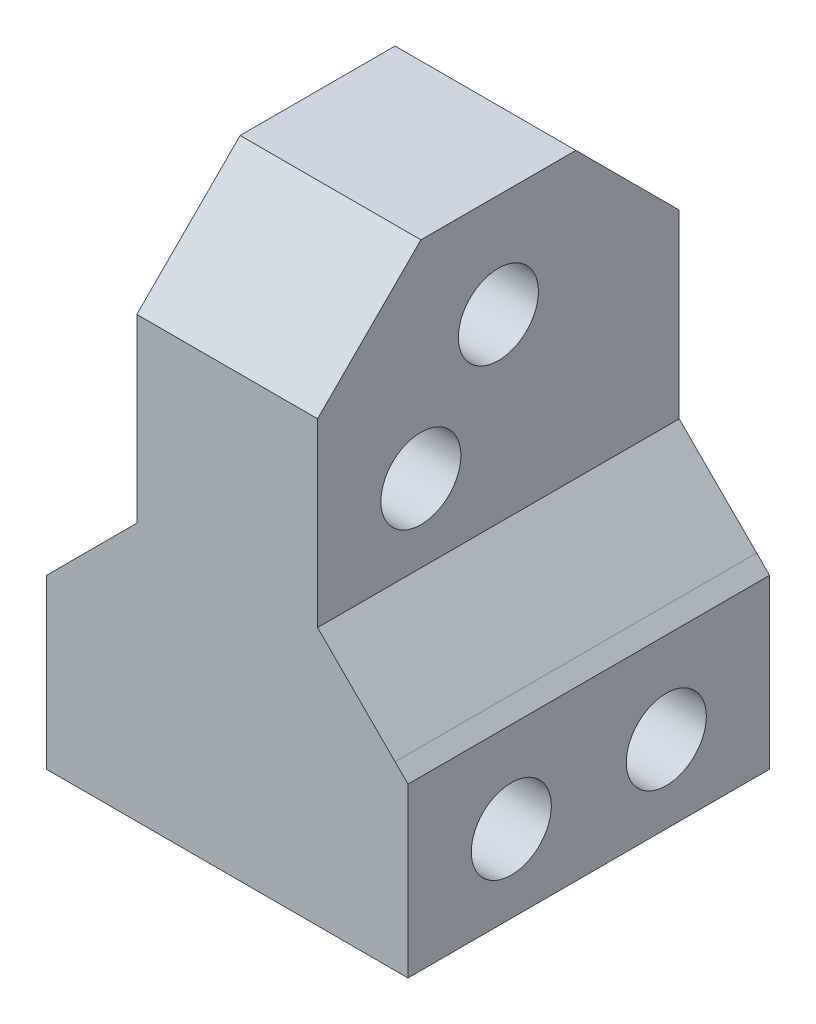
ISO-10303-21;
HEADER;
FILE_DESCRIPTION(('STEP AP214'),'2;1');
FILE_NAME('part.step','',(''),(''),'','','');
FILE_SCHEMA(('AUTOMOTIVE_DESIGN { 1 0 10303 214 1 1 1 1 }'));
ENDSEC;
DATA;
#1=APPLICATION_CONTEXT('core data for automotive mechanical design processes');
#2=APPLICATION_PROTOCOL_DEFINITION('international standard','automotive_design',2000,#1);
#3=PRODUCT_CONTEXT('',#1,'mechanical');
#4=PRODUCT('Part','Part','',(#3));
#5=PRODUCT_RELATED_PRODUCT_CATEGORY('part','',(#4));
#6=PRODUCT_DEFINITION_FORMATION('','',#4);
#7=PRODUCT_DEFINITION_CONTEXT('part definition',#1,'design');
#8=PRODUCT_DEFINITION('design','',#6,#7);
#9=PRODUCT_DEFINITION_SHAPE('','',#8);
#10=(LENGTH_UNIT() NAMED_UNIT(*) SI_UNIT(.MILLI.,.METRE.));
#11=(NAMED_UNIT(*) PLANE_ANGLE_UNIT() SI_UNIT($,.RADIAN.));
#12=(NAMED_UNIT(*) SI_UNIT($,.STERADIAN.) SOLID_ANGLE_UNIT());
#13=UNCERTAINTY_MEASURE_WITH_UNIT(LENGTH_MEASURE(1.E-05),#10,'distance_accuracy_value','');
#14=(GEOMETRIC_REPRESENTATION_CONTEXT(3) GLOBAL_UNCERTAINTY_ASSIGNED_CONTEXT((#13)) GLOBAL_UNIT_ASSIGNED_CONTEXT((#10,
#11,#12)) REPRESENTATION_CONTEXT('',''));
#15=CARTESIAN_POINT('',(0.,0.,0.));
#16=DIRECTION('',(0.,0.,1.));
#17=DIRECTION('',(1.,0.,0.));
#18=AXIS2_PLACEMENT_3D('',#15,#16,#17);
#19=CARTESIAN_POINT('',(0.,7.,0.));
#20=DIRECTION('',(1.,0.,0.));
#21=DIRECTION('',(0.,0.,-1.));
#22=AXIS2_PLACEMENT_3D('',#19,#20,#21);
#23=PLANE('',#22);
#24=CARTESIAN_POINT('',(0.,3.,-4.));
#25=DIRECTION('',(1.,0.,0.));
#26=DIRECTION('',(0.,0.,-1.));
#27=AXIS2_PLACEMENT_3D('',#24,#25,#26);
#28=CIRCLE('',#27,1.55);
#29=CARTESIAN_POINT('',(0.,3.,-5.55));
#30=VERTEX_POINT('',#29);
#31=EDGE_CURVE('E192',#30,#30,#28,.T.);
#32=ORIENTED_EDGE('',*,*,#31,.T.);
#33=EDGE_LOOP('',(#32));
#34=FACE_BOUND('',#33,.T.);
#35=CARTESIAN_POINT('',(0.,3.,-10.));
#36=DIRECTION('',(1.,0.,0.));
#37=DIRECTION('',(0.,0.,-1.));
#38=AXIS2_PLACEMENT_3D('',#35,#36,#37);
#39=CIRCLE('',#38,1.55);
#40=CARTESIAN_POINT('',(0.,3.,-11.55));
#41=VERTEX_POINT('',#40);
#42=EDGE_CURVE('E193',#41,#41,#39,.T.);
#43=ORIENTED_EDGE('',*,*,#42,.T.);
#44=EDGE_LOOP('',(#43));
#45=FACE_BOUND('',#44,.T.);
#46=DIRECTION('',(0.,-1.,0.));
#47=VECTOR('',#46,1.);
#48=CARTESIAN_POINT('',(0.,7.,0.));
#49=LINE('',#48,#47);
#50=CARTESIAN_POINT('',(0.,6.5,0.));
#51=VERTEX_POINT('',#50);
#52=CARTESIAN_POINT('',(0.,0.,0.));
#53=VERTEX_POINT('',#52);
#54=EDGE_CURVE('E239',#51,#53,#49,.T.);
#55=ORIENTED_EDGE('',*,*,#54,.F.);
#56=DIRECTION('',(0.,0.,-1.));
#57=VECTOR('',#56,1.);
#58=CARTESIAN_POINT('',(0.,6.5,0.));
#59=LINE('',#58,#57);
#60=CARTESIAN_POINT('',(0.,6.5,-14.));
#61=VERTEX_POINT('',#60);
#62=EDGE_CURVE('E275',#51,#61,#59,.T.);
#63=ORIENTED_EDGE('',*,*,#62,.T.);
#64=DIRECTION('',(0.,-1.,0.));
#65=VECTOR('',#64,1.);
#66=CARTESIAN_POINT('',(0.,7.,-14.));
#67=LINE('',#66,#65);
#68=CARTESIAN_POINT('',(0.,0.,-14.));
#69=VERTEX_POINT('',#68);
#70=EDGE_CURVE('E233',#61,#69,#67,.T.);
#71=ORIENTED_EDGE('',*,*,#70,.T.);
#72=DIRECTION('',(0.,0.,1.));
#73=VECTOR('',#72,1.);
#74=CARTESIAN_POINT('',(0.,0.,0.));
#75=LINE('',#74,#73);
#76=EDGE_CURVE('E221',#69,#53,#75,.T.);
#77=ORIENTED_EDGE('',*,*,#76,.T.);
#78=EDGE_LOOP('',(#55,#63,#71,#77));
#79=FACE_BOUND('',#78,.T.);
#80=ADVANCED_FACE('F35',(#34,#45,#79),#23,.F.);
#81=CARTESIAN_POINT('',(0.,7.,0.));
#82=DIRECTION('',(0.,0.,-1.));
#83=DIRECTION('',(-1.,0.,0.));
#84=AXIS2_PLACEMENT_3D('',#81,#82,#83);
#85=PLANE('',#84);
#86=DIRECTION('',(0.,-1.,0.));
#87=VECTOR('',#86,1.);
#88=CARTESIAN_POINT('',(10.5,21.,0.));
#89=LINE('',#88,#87);
#90=CARTESIAN_POINT('',(10.5,17.,0.));
#91=VERTEX_POINT('',#90);
#92=CARTESIAN_POINT('',(10.5,10.,0.));
#93=VERTEX_POINT('',#92);
#94=EDGE_CURVE('E217',#91,#93,#89,.T.);
#95=ORIENTED_EDGE('',*,*,#94,.F.);
#96=DIRECTION('',(-1.,0.,0.));
#97=VECTOR('',#96,1.);
#98=CARTESIAN_POINT('',(3.5,17.,0.));
#99=LINE('',#98,#97);
#100=CARTESIAN_POINT('',(3.5,17.,0.));
#101=VERTEX_POINT('',#100);
#102=EDGE_CURVE('E11',#91,#101,#99,.T.);
#103=ORIENTED_EDGE('',*,*,#102,.T.);
#104=DIRECTION('',(0.,-1.,0.));
#105=VECTOR('',#104,1.);
#106=CARTESIAN_POINT('',(3.5,21.,0.));
#107=LINE('',#106,#105);
#108=CARTESIAN_POINT('',(3.5,10.,0.));
#109=VERTEX_POINT('',#108);
#110=EDGE_CURVE('E219',#101,#109,#107,.T.);
#111=ORIENTED_EDGE('',*,*,#110,.T.);
#112=DIRECTION('',(0.707106781186544,0.707106781186551,0.));
#113=VECTOR('',#112,1.);
#114=CARTESIAN_POINT('',(0.250000000000009,6.74999999999999,0.));
#115=LINE('',#114,#113);
#116=CARTESIAN_POINT('',(0.500000000000013,7.,0.));
#117=VERTEX_POINT('',#116);
#118=EDGE_CURVE('E253',#109,#117,#115,.F.);
#119=ORIENTED_EDGE('',*,*,#118,.T.);
#120=DIRECTION('',(0.707106781186545,0.70710678118655,0.));
#121=VECTOR('',#120,1.);
#122=CARTESIAN_POINT('',(0.5,7.,0.));
#123=LINE('',#122,#121);
#124=EDGE_CURVE('E271',#117,#51,#123,.F.);
#125=ORIENTED_EDGE('',*,*,#124,.T.);
#126=ORIENTED_EDGE('',*,*,#54,.T.);
#127=DIRECTION('',(1.,0.,0.));
#128=VECTOR('',#127,1.);
#129=CARTESIAN_POINT('',(0.,0.,0.));
#130=LINE('',#129,#128);
#131=CARTESIAN_POINT('',(14.,0.,0.));
#132=VERTEX_POINT('',#131);
#133=EDGE_CURVE('E224',#53,#132,#130,.T.);
#134=ORIENTED_EDGE('',*,*,#133,.T.);
#135=DIRECTION('',(0.,-1.,0.));
#136=VECTOR('',#135,1.);
#137=CARTESIAN_POINT('',(14.,7.,0.));
#138=LINE('',#137,#136);
#139=CARTESIAN_POINT('',(14.,6.5,0.));
#140=VERTEX_POINT('',#139);
#141=EDGE_CURVE('E237',#140,#132,#138,.T.);
#142=ORIENTED_EDGE('',*,*,#141,.F.);
#143=DIRECTION('',(0.707106781186545,-0.70710678118655,0.));
#144=VECTOR('',#143,1.);
#145=CARTESIAN_POINT('',(13.5,7.,0.));
#146=LINE('',#145,#144);
#147=CARTESIAN_POINT('',(13.5,7.,0.));
#148=VERTEX_POINT('',#147);
#149=EDGE_CURVE('E273',#140,#148,#146,.F.);
#150=ORIENTED_EDGE('',*,*,#149,.T.);
#151=DIRECTION('',(0.707106781186544,-0.707106781186551,0.));
#152=VECTOR('',#151,1.);
#153=CARTESIAN_POINT('',(6.75000000000006,13.75,0.));
#154=LINE('',#153,#152);
#155=EDGE_CURVE('E262',#148,#93,#154,.F.);
#156=ORIENTED_EDGE('',*,*,#155,.T.);
#157=EDGE_LOOP('',(#95,#103,#111,#119,#125,#126,#134,#142,#150,#156));
#158=FACE_BOUND('',#157,.T.);
#159=ADVANCED_FACE('F319',(#158),#85,.F.);
#160=CARTESIAN_POINT('',(14.,7.,0.));
#161=DIRECTION('',(-1.,0.,0.));
#162=DIRECTION('',(0.,0.,1.));
#163=AXIS2_PLACEMENT_3D('',#160,#161,#162);
#164=PLANE('',#163);
#165=CARTESIAN_POINT('',(14.,3.,-4.));
#166=DIRECTION('',(1.,0.,0.));
#167=DIRECTION('',(0.,0.,-1.));
#168=AXIS2_PLACEMENT_3D('',#165,#166,#167);
#169=CIRCLE('',#168,1.55);
#170=CARTESIAN_POINT('',(14.,3.,-5.55));
#171=VERTEX_POINT('',#170);
#172=EDGE_CURVE('E189',#171,#171,#169,.T.);
#173=ORIENTED_EDGE('',*,*,#172,.F.);
#174=EDGE_LOOP('',(#173));
#175=FACE_BOUND('',#174,.T.);
#176=CARTESIAN_POINT('',(14.,3.,-10.));
#177=DIRECTION('',(1.,0.,0.));
#178=DIRECTION('',(0.,0.,-1.));
#179=AXIS2_PLACEMENT_3D('',#176,#177,#178);
#180=CIRCLE('',#179,1.55);
#181=CARTESIAN_POINT('',(14.,3.,-11.55));
#182=VERTEX_POINT('',#181);
#183=EDGE_CURVE('E185',#182,#182,#180,.T.);
#184=ORIENTED_EDGE('',*,*,#183,.F.);
#185=EDGE_LOOP('',(#184));
#186=FACE_BOUND('',#185,.T.);
#187=DIRECTION('',(0.,-1.,0.));
#188=VECTOR('',#187,1.);
#189=CARTESIAN_POINT('',(14.,7.,-14.));
#190=LINE('',#189,#188);
#191=CARTESIAN_POINT('',(14.,6.5,-14.));
#192=VERTEX_POINT('',#191);
#193=CARTESIAN_POINT('',(14.,0.,-14.));
#194=VERTEX_POINT('',#193);
#195=EDGE_CURVE('E235',#192,#194,#190,.T.);
#196=ORIENTED_EDGE('',*,*,#195,.F.);
#197=DIRECTION('',(0.,0.,1.));
#198=VECTOR('',#197,1.);
#199=CARTESIAN_POINT('',(14.,6.5,0.));
#200=LINE('',#199,#198);
#201=EDGE_CURVE('E269',#192,#140,#200,.T.);
#202=ORIENTED_EDGE('',*,*,#201,.T.);
#203=ORIENTED_EDGE('',*,*,#141,.T.);
#204=DIRECTION('',(0.,0.,-1.));
#205=VECTOR('',#204,1.);
#206=CARTESIAN_POINT('',(14.,0.,0.));
#207=LINE('',#206,#205);
#208=EDGE_CURVE('E227',#132,#194,#207,.T.);
#209=ORIENTED_EDGE('',*,*,#208,.T.);
#210=EDGE_LOOP('',(#196,#202,#203,#209));
#211=FACE_BOUND('',#210,.T.);
#212=ADVANCED_FACE('F371',(#175,#186,#211),#164,.F.);
#213=CARTESIAN_POINT('',(0.,7.,-14.));
#214=DIRECTION('',(0.,0.,1.));
#215=DIRECTION('',(1.,0.,0.));
#216=AXIS2_PLACEMENT_3D('',#213,#214,#215);
#217=PLANE('',#216);
#218=DIRECTION('',(0.,-1.,0.));
#219=VECTOR('',#218,1.);
#220=CARTESIAN_POINT('',(3.5,21.,-14.));
#221=LINE('',#220,#219);
#222=CARTESIAN_POINT('',(3.5,17.,-14.));
#223=VERTEX_POINT('',#222);
#224=CARTESIAN_POINT('',(3.5,10.,-14.));
#225=VERTEX_POINT('',#224);
#226=EDGE_CURVE('E213',#223,#225,#221,.T.);
#227=ORIENTED_EDGE('',*,*,#226,.F.);
#228=DIRECTION('',(1.,0.,0.));
#229=VECTOR('',#228,1.);
#230=CARTESIAN_POINT('',(10.5,17.,-14.));
#231=LINE('',#230,#229);
#232=CARTESIAN_POINT('',(10.5,17.,-14.));
#233=VERTEX_POINT('',#232);
#234=EDGE_CURVE('E287',#223,#233,#231,.T.);
#235=ORIENTED_EDGE('',*,*,#234,.T.);
#236=DIRECTION('',(0.,-1.,0.));
#237=VECTOR('',#236,1.);
#238=CARTESIAN_POINT('',(10.5,21.,-14.));
#239=LINE('',#238,#237);
#240=CARTESIAN_POINT('',(10.5,10.,-14.));
#241=VERTEX_POINT('',#240);
#242=EDGE_CURVE('E215',#233,#241,#239,.T.);
#243=ORIENTED_EDGE('',*,*,#242,.T.);
#244=DIRECTION('',(-0.707106781186544,0.707106781186551,0.));
#245=VECTOR('',#244,1.);
#246=CARTESIAN_POINT('',(6.75000000000006,13.75,-14.));
#247=LINE('',#246,#245);
#248=CARTESIAN_POINT('',(13.5,7.,-14.));
#249=VERTEX_POINT('',#248);
#250=EDGE_CURVE('E259',#241,#249,#247,.F.);
#251=ORIENTED_EDGE('',*,*,#250,.T.);
#252=DIRECTION('',(-0.707106781186545,0.70710678118655,0.));
#253=VECTOR('',#252,1.);
#254=CARTESIAN_POINT('',(13.5,7.,-14.));
#255=LINE('',#254,#253);
#256=EDGE_CURVE('E267',#249,#192,#255,.F.);
#257=ORIENTED_EDGE('',*,*,#256,.T.);
#258=ORIENTED_EDGE('',*,*,#195,.T.);
#259=DIRECTION('',(-1.,0.,0.));
#260=VECTOR('',#259,1.);
#261=CARTESIAN_POINT('',(0.,0.,-14.));
#262=LINE('',#261,#260);
#263=EDGE_CURVE('E230',#194,#69,#262,.T.);
#264=ORIENTED_EDGE('',*,*,#263,.T.);
#265=ORIENTED_EDGE('',*,*,#70,.F.);
#266=DIRECTION('',(-0.707106781186545,-0.70710678118655,0.));
#267=VECTOR('',#266,1.);
#268=CARTESIAN_POINT('',(0.5,7.,-14.));
#269=LINE('',#268,#267);
#270=CARTESIAN_POINT('',(0.500000000000011,7.,-14.));
#271=VERTEX_POINT('',#270);
#272=EDGE_CURVE('E265',#61,#271,#269,.F.);
#273=ORIENTED_EDGE('',*,*,#272,.T.);
#274=DIRECTION('',(-0.707106781186544,-0.707106781186551,0.));
#275=VECTOR('',#274,1.);
#276=CARTESIAN_POINT('',(0.250000000000008,6.74999999999999,-14.));
#277=LINE('',#276,#275);
#278=EDGE_CURVE('E256',#271,#225,#277,.F.);
#279=ORIENTED_EDGE('',*,*,#278,.T.);
#280=EDGE_LOOP('',(#227,#235,#243,#251,#257,#258,#264,#265,#273,#279));
#281=FACE_BOUND('',#280,.T.);
#282=ADVANCED_FACE('F336',(#281),#217,.F.);
#283=CARTESIAN_POINT('',(0.,0.,0.));
#284=DIRECTION('',(0.,-1.,0.));
#285=DIRECTION('',(0.,0.,-1.));
#286=AXIS2_PLACEMENT_3D('',#283,#284,#285);
#287=PLANE('',#286);
#288=DIRECTION('',(0.,0.,-1.));
#289=VECTOR('',#288,1.);
#290=CARTESIAN_POINT('',(3.8,0.,-0.5));
#291=LINE('',#290,#289);
#292=CARTESIAN_POINT('',(3.8,0.,-0.5));
#293=VERTEX_POINT('',#292);
#294=CARTESIAN_POINT('',(3.8,0.,-13.5));
#295=VERTEX_POINT('',#294);
#296=EDGE_CURVE('E53',#293,#295,#291,.T.);
#297=ORIENTED_EDGE('',*,*,#296,.F.);
#298=DIRECTION('',(-1.,0.,0.));
#299=VECTOR('',#298,1.);
#300=CARTESIAN_POINT('',(3.8,0.,-0.5));
#301=LINE('',#300,#299);
#302=CARTESIAN_POINT('',(10.2,0.,-0.499999999999999));
#303=VERTEX_POINT('',#302);
#304=EDGE_CURVE('E170',#303,#293,#301,.T.);
#305=ORIENTED_EDGE('',*,*,#304,.F.);
#306=DIRECTION('',(0.,0.,1.));
#307=VECTOR('',#306,1.);
#308=CARTESIAN_POINT('',(10.2,0.,-0.499999999999999));
#309=LINE('',#308,#307);
#310=CARTESIAN_POINT('',(10.2,0.,-13.5));
#311=VERTEX_POINT('',#310);
#312=EDGE_CURVE('E173',#311,#303,#309,.T.);
#313=ORIENTED_EDGE('',*,*,#312,.F.);
#314=DIRECTION('',(1.,0.,0.));
#315=VECTOR('',#314,1.);
#316=CARTESIAN_POINT('',(3.8,0.,-13.5));
#317=LINE('',#316,#315);
#318=EDGE_CURVE('E179',#295,#311,#317,.T.);
#319=ORIENTED_EDGE('',*,*,#318,.F.);
#320=EDGE_LOOP('',(#297,#305,#313,#319));
#321=FACE_BOUND('',#320,.T.);
#322=ORIENTED_EDGE('',*,*,#76,.F.);
#323=ORIENTED_EDGE('',*,*,#263,.F.);
#324=ORIENTED_EDGE('',*,*,#208,.F.);
#325=ORIENTED_EDGE('',*,*,#133,.F.);
#326=EDGE_LOOP('',(#322,#323,#324,#325));
#327=FACE_BOUND('',#326,.T.);
#328=ADVANCED_FACE('F305',(#321,#327),#287,.T.);
#329=CARTESIAN_POINT('',(3.5,21.,-14.));
#330=DIRECTION('',(1.,0.,0.));
#331=DIRECTION('',(0.,0.,-1.));
#332=AXIS2_PLACEMENT_3D('',#329,#330,#331);
#333=PLANE('',#332);
#334=CARTESIAN_POINT('',(3.5,17.,-7.));
#335=DIRECTION('',(1.,0.,0.));
#336=DIRECTION('',(0.,0.,-1.));
#337=AXIS2_PLACEMENT_3D('',#334,#335,#336);
#338=CIRCLE('',#337,1.55);
#339=CARTESIAN_POINT('',(3.5,17.,-8.55));
#340=VERTEX_POINT('',#339);
#341=EDGE_CURVE('E204',#340,#340,#338,.T.);
#342=ORIENTED_EDGE('',*,*,#341,.T.);
#343=EDGE_LOOP('',(#342));
#344=FACE_BOUND('',#343,.T.);
#345=CARTESIAN_POINT('',(3.5,13.,-4.));
#346=DIRECTION('',(1.,0.,0.));
#347=DIRECTION('',(0.,0.,-1.));
#348=AXIS2_PLACEMENT_3D('',#345,#346,#347);
#349=CIRCLE('',#348,1.55);
#350=CARTESIAN_POINT('',(3.5,13.,-5.55));
#351=VERTEX_POINT('',#350);
#352=EDGE_CURVE('E201',#351,#351,#349,.T.);
#353=ORIENTED_EDGE('',*,*,#352,.T.);
#354=EDGE_LOOP('',(#353));
#355=FACE_BOUND('',#354,.T.);
#356=DIRECTION('',(0.,0.,1.));
#357=VECTOR('',#356,1.);
#358=CARTESIAN_POINT('',(3.5,21.,-14.));
#359=LINE('',#358,#357);
#360=CARTESIAN_POINT('',(3.5,21.,-10.));
#361=VERTEX_POINT('',#360);
#362=CARTESIAN_POINT('',(3.5,21.,-4.));
#363=VERTEX_POINT('',#362);
#364=EDGE_CURVE('E207',#361,#363,#359,.T.);
#365=ORIENTED_EDGE('',*,*,#364,.F.);
#366=DIRECTION('',(0.,-0.707106781186548,-0.707106781186547));
#367=VECTOR('',#366,1.);
#368=CARTESIAN_POINT('',(3.5,21.,-10.));
#369=LINE('',#368,#367);
#370=EDGE_CURVE('E285',#361,#223,#369,.T.);
#371=ORIENTED_EDGE('',*,*,#370,.T.);
#372=ORIENTED_EDGE('',*,*,#226,.T.);
#373=DIRECTION('',(0.,0.,1.));
#374=VECTOR('',#373,1.);
#375=CARTESIAN_POINT('',(3.5,10.,0.));
#376=LINE('',#375,#374);
#377=EDGE_CURVE('E241',#225,#109,#376,.T.);
#378=ORIENTED_EDGE('',*,*,#377,.T.);
#379=ORIENTED_EDGE('',*,*,#110,.F.);
#380=DIRECTION('',(0.,0.707106781186549,-0.707106781186546));
#381=VECTOR('',#380,1.);
#382=CARTESIAN_POINT('',(3.5,21.,-4.));
#383=LINE('',#382,#381);
#384=EDGE_CURVE('E283',#101,#363,#383,.T.);
#385=ORIENTED_EDGE('',*,*,#384,.T.);
#386=EDGE_LOOP('',(#365,#371,#372,#378,#379,#385));
#387=FACE_BOUND('',#386,.T.);
#388=ADVANCED_FACE('F302',(#344,#355,#387),#333,.F.);
#389=CARTESIAN_POINT('',(10.5,21.,-14.));
#390=DIRECTION('',(-1.,0.,0.));
#391=DIRECTION('',(0.,0.,1.));
#392=AXIS2_PLACEMENT_3D('',#389,#390,#391);
#393=PLANE('',#392);
#394=CARTESIAN_POINT('',(10.5,17.,-7.));
#395=DIRECTION('',(-1.,0.,0.));
#396=DIRECTION('',(0.,0.,1.));
#397=AXIS2_PLACEMENT_3D('',#394,#395,#396);
#398=CIRCLE('',#397,1.55);
#399=CARTESIAN_POINT('',(10.5,17.,-5.45));
#400=VERTEX_POINT('',#399);
#401=EDGE_CURVE('E40',#400,#400,#398,.T.);
#402=ORIENTED_EDGE('',*,*,#401,.T.);
#403=EDGE_LOOP('',(#402));
#404=FACE_BOUND('',#403,.T.);
#405=CARTESIAN_POINT('',(10.5,13.,-4.));
#406=DIRECTION('',(-1.,0.,0.));
#407=DIRECTION('',(0.,0.,1.));
#408=AXIS2_PLACEMENT_3D('',#405,#406,#407);
#409=CIRCLE('',#408,1.55);
#410=CARTESIAN_POINT('',(10.5,13.,-2.45));
#411=VERTEX_POINT('',#410);
#412=EDGE_CURVE('E196',#411,#411,#409,.T.);
#413=ORIENTED_EDGE('',*,*,#412,.T.);
#414=EDGE_LOOP('',(#413));
#415=FACE_BOUND('',#414,.T.);
#416=ORIENTED_EDGE('',*,*,#242,.F.);
#417=DIRECTION('',(0.,0.707106781186548,0.707106781186547));
#418=VECTOR('',#417,1.);
#419=CARTESIAN_POINT('',(10.5,21.,-10.));
#420=LINE('',#419,#418);
#421=CARTESIAN_POINT('',(10.5,21.,-10.));
#422=VERTEX_POINT('',#421);
#423=EDGE_CURVE('E45',#233,#422,#420,.T.);
#424=ORIENTED_EDGE('',*,*,#423,.T.);
#425=DIRECTION('',(0.,0.,-1.));
#426=VECTOR('',#425,1.);
#427=CARTESIAN_POINT('',(10.5,21.,-14.));
#428=LINE('',#427,#426);
#429=CARTESIAN_POINT('',(10.5,21.,-4.));
#430=VERTEX_POINT('',#429);
#431=EDGE_CURVE('E210',#430,#422,#428,.T.);
#432=ORIENTED_EDGE('',*,*,#431,.F.);
#433=DIRECTION('',(0.,-0.707106781186549,0.707106781186546));
#434=VECTOR('',#433,1.);
#435=CARTESIAN_POINT('',(10.5,21.,-4.));
#436=LINE('',#435,#434);
#437=EDGE_CURVE('E61',#430,#91,#436,.T.);
#438=ORIENTED_EDGE('',*,*,#437,.T.);
#439=ORIENTED_EDGE('',*,*,#94,.T.);
#440=DIRECTION('',(0.,0.,-1.));
#441=VECTOR('',#440,1.);
#442=CARTESIAN_POINT('',(10.5,10.,-14.));
#443=LINE('',#442,#441);
#444=EDGE_CURVE('E247',#93,#241,#443,.T.);
#445=ORIENTED_EDGE('',*,*,#444,.T.);
#446=EDGE_LOOP('',(#416,#424,#432,#438,#439,#445));
#447=FACE_BOUND('',#446,.T.);
#448=ADVANCED_FACE('F293',(#404,#415,#447),#393,.F.);
#449=CARTESIAN_POINT('',(0.,21.,0.));
#450=DIRECTION('',(0.,1.,0.));
#451=DIRECTION('',(0.,0.,1.));
#452=AXIS2_PLACEMENT_3D('',#449,#450,#451);
#453=PLANE('',#452);
#454=ORIENTED_EDGE('',*,*,#431,.T.);
#455=DIRECTION('',(-1.,0.,0.));
#456=VECTOR('',#455,1.);
#457=CARTESIAN_POINT('',(3.5,21.,-10.));
#458=LINE('',#457,#456);
#459=EDGE_CURVE('E280',#422,#361,#458,.T.);
#460=ORIENTED_EDGE('',*,*,#459,.T.);
#461=ORIENTED_EDGE('',*,*,#364,.T.);
#462=DIRECTION('',(1.,0.,0.));
#463=VECTOR('',#462,1.);
#464=CARTESIAN_POINT('',(10.5,21.,-4.));
#465=LINE('',#464,#463);
#466=EDGE_CURVE('E277',#363,#430,#465,.T.);
#467=ORIENTED_EDGE('',*,*,#466,.T.);
#468=EDGE_LOOP('',(#454,#460,#461,#467));
#469=FACE_BOUND('',#468,.T.);
#470=ADVANCED_FACE('F314',(#469),#453,.T.);
#471=CARTESIAN_POINT('',(3.5,10.,-14.));
#472=DIRECTION('',(-0.707106781186551,0.707106781186544,0.));
#473=DIRECTION('',(0.,0.,-1.));
#474=AXIS2_PLACEMENT_3D('',#471,#472,#473);
#475=PLANE('',#474);
#476=ORIENTED_EDGE('',*,*,#278,.F.);
#477=DIRECTION('',(0.,0.,-1.));
#478=VECTOR('',#477,1.);
#479=CARTESIAN_POINT('',(0.500000000000011,7.,-14.));
#480=LINE('',#479,#478);
#481=EDGE_CURVE('E244',#117,#271,#480,.T.);
#482=ORIENTED_EDGE('',*,*,#481,.F.);
#483=ORIENTED_EDGE('',*,*,#118,.F.);
#484=ORIENTED_EDGE('',*,*,#377,.F.);
#485=EDGE_LOOP('',(#476,#482,#483,#484));
#486=FACE_BOUND('',#485,.T.);
#487=ADVANCED_FACE('F324',(#486),#475,.T.);
#488=CARTESIAN_POINT('',(10.5,10.,-14.));
#489=DIRECTION('',(0.707106781186551,0.707106781186544,0.));
#490=DIRECTION('',(0.,0.,1.));
#491=AXIS2_PLACEMENT_3D('',#488,#489,#490);
#492=PLANE('',#491);
#493=ORIENTED_EDGE('',*,*,#155,.F.);
#494=DIRECTION('',(0.,0.,1.));
#495=VECTOR('',#494,1.);
#496=CARTESIAN_POINT('',(13.5,7.,0.));
#497=LINE('',#496,#495);
#498=EDGE_CURVE('E250',#249,#148,#497,.T.);
#499=ORIENTED_EDGE('',*,*,#498,.F.);
#500=ORIENTED_EDGE('',*,*,#250,.F.);
#501=ORIENTED_EDGE('',*,*,#444,.F.);
#502=EDGE_LOOP('',(#493,#499,#500,#501));
#503=FACE_BOUND('',#502,.T.);
#504=ADVANCED_FACE('F351',(#503),#492,.T.);
#505=CARTESIAN_POINT('',(13.5,7.,0.));
#506=DIRECTION('',(-0.70710678118655,-0.707106781186545,0.));
#507=DIRECTION('',(0.,0.,-1.));
#508=AXIS2_PLACEMENT_3D('',#505,#506,#507);
#509=PLANE('',#508);
#510=ORIENTED_EDGE('',*,*,#149,.F.);
#511=ORIENTED_EDGE('',*,*,#201,.F.);
#512=ORIENTED_EDGE('',*,*,#256,.F.);
#513=ORIENTED_EDGE('',*,*,#498,.T.);
#514=EDGE_LOOP('',(#510,#511,#512,#513));
#515=FACE_BOUND('',#514,.T.);
#516=ADVANCED_FACE('F347',(#515),#509,.F.);
#517=CARTESIAN_POINT('',(0.5,7.,0.));
#518=DIRECTION('',(0.70710678118655,-0.707106781186545,0.));
#519=DIRECTION('',(0.,0.,1.));
#520=AXIS2_PLACEMENT_3D('',#517,#518,#519);
#521=PLANE('',#520);
#522=ORIENTED_EDGE('',*,*,#272,.F.);
#523=ORIENTED_EDGE('',*,*,#62,.F.);
#524=ORIENTED_EDGE('',*,*,#124,.F.);
#525=ORIENTED_EDGE('',*,*,#481,.T.);
#526=EDGE_LOOP('',(#522,#523,#524,#525));
#527=FACE_BOUND('',#526,.T.);
#528=ADVANCED_FACE('F334',(#527),#521,.F.);
#529=CARTESIAN_POINT('',(0.,21.,-10.));
#530=DIRECTION('',(0.,0.707106781186547,-0.707106781186548));
#531=DIRECTION('',(1.,0.,0.));
#532=AXIS2_PLACEMENT_3D('',#529,#530,#531);
#533=PLANE('',#532);
#534=ORIENTED_EDGE('',*,*,#423,.F.);
#535=ORIENTED_EDGE('',*,*,#234,.F.);
#536=ORIENTED_EDGE('',*,*,#370,.F.);
#537=ORIENTED_EDGE('',*,*,#459,.F.);
#538=EDGE_LOOP('',(#534,#535,#536,#537));
#539=FACE_BOUND('',#538,.T.);
#540=ADVANCED_FACE('F357',(#539),#533,.T.);
#541=CARTESIAN_POINT('',(0.,21.,-4.));
#542=DIRECTION('',(0.,0.707106781186546,0.707106781186549));
#543=DIRECTION('',(-1.,0.,0.));
#544=AXIS2_PLACEMENT_3D('',#541,#542,#543);
#545=PLANE('',#544);
#546=ORIENTED_EDGE('',*,*,#384,.F.);
#547=ORIENTED_EDGE('',*,*,#102,.F.);
#548=ORIENTED_EDGE('',*,*,#437,.F.);
#549=ORIENTED_EDGE('',*,*,#466,.F.);
#550=EDGE_LOOP('',(#546,#547,#548,#549));
#551=FACE_BOUND('',#550,.T.);
#552=ADVANCED_FACE('F38',(#551),#545,.T.);
#553=CARTESIAN_POINT('',(0.,13.,-4.));
#554=DIRECTION('',(1.,0.,0.));
#555=DIRECTION('',(0.,0.,-1.));
#556=AXIS2_PLACEMENT_3D('',#553,#554,#555);
#557=CYLINDRICAL_SURFACE('',#556,1.55);
#558=ORIENTED_EDGE('',*,*,#412,.F.);
#559=EDGE_LOOP('',(#558));
#560=FACE_BOUND('',#559,.T.);
#561=ORIENTED_EDGE('',*,*,#352,.F.);
#562=EDGE_LOOP('',(#561));
#563=FACE_BOUND('',#562,.T.);
#564=ADVANCED_FACE('F295',(#560,#563),#557,.F.);
#565=CARTESIAN_POINT('',(0.,17.,-7.));
#566=DIRECTION('',(1.,0.,0.));
#567=DIRECTION('',(0.,0.,-1.));
#568=AXIS2_PLACEMENT_3D('',#565,#566,#567);
#569=CYLINDRICAL_SURFACE('',#568,1.55);
#570=ORIENTED_EDGE('',*,*,#401,.F.);
#571=EDGE_LOOP('',(#570));
#572=FACE_BOUND('',#571,.T.);
#573=ORIENTED_EDGE('',*,*,#341,.F.);
#574=EDGE_LOOP('',(#573));
#575=FACE_BOUND('',#574,.T.);
#576=ADVANCED_FACE('F298',(#572,#575),#569,.F.);
#577=CARTESIAN_POINT('',(0.,3.,-10.));
#578=DIRECTION('',(1.,0.,0.));
#579=DIRECTION('',(0.,0.,-1.));
#580=AXIS2_PLACEMENT_3D('',#577,#578,#579);
#581=CYLINDRICAL_SURFACE('',#580,1.55);
#582=ORIENTED_EDGE('',*,*,#42,.F.);
#583=EDGE_LOOP('',(#582));
#584=FACE_BOUND('',#583,.T.);
#585=ORIENTED_EDGE('',*,*,#183,.T.);
#586=EDGE_LOOP('',(#585));
#587=FACE_BOUND('',#586,.T.);
#588=ADVANCED_FACE('F484',(#584,#587),#581,.F.);
#589=CARTESIAN_POINT('',(0.,3.,-4.));
#590=DIRECTION('',(1.,0.,0.));
#591=DIRECTION('',(0.,0.,-1.));
#592=AXIS2_PLACEMENT_3D('',#589,#590,#591);
#593=CYLINDRICAL_SURFACE('',#592,1.55);
#594=ORIENTED_EDGE('',*,*,#31,.F.);
#595=EDGE_LOOP('',(#594));
#596=FACE_BOUND('',#595,.T.);
#597=ORIENTED_EDGE('',*,*,#172,.T.);
#598=EDGE_LOOP('',(#597));
#599=FACE_BOUND('',#598,.T.);
#600=ADVANCED_FACE('F494',(#596,#599),#593,.F.);
#601=CARTESIAN_POINT('',(3.8,0.54,-0.5));
#602=DIRECTION('',(-1.,0.,0.));
#603=DIRECTION('',(0.,0.,1.));
#604=AXIS2_PLACEMENT_3D('',#601,#602,#603);
#605=PLANE('',#604);
#606=ORIENTED_EDGE('',*,*,#296,.T.);
#607=DIRECTION('',(0.,-1.,0.));
#608=VECTOR('',#607,1.);
#609=CARTESIAN_POINT('',(3.8,0.54,-13.5));
#610=LINE('',#609,#608);
#611=CARTESIAN_POINT('',(3.8,0.54,-13.5));
#612=VERTEX_POINT('',#611);
#613=EDGE_CURVE('E148',#612,#295,#610,.T.);
#614=ORIENTED_EDGE('',*,*,#613,.F.);
#615=DIRECTION('',(0.,0.,-1.));
#616=VECTOR('',#615,1.);
#617=CARTESIAN_POINT('',(3.8,0.54,-0.5));
#618=LINE('',#617,#616);
#619=CARTESIAN_POINT('',(3.8,0.54,-0.5));
#620=VERTEX_POINT('',#619);
#621=EDGE_CURVE('E152',#620,#612,#618,.T.);
#622=ORIENTED_EDGE('',*,*,#621,.F.);
#623=DIRECTION('',(0.,-1.,0.));
#624=VECTOR('',#623,1.);
#625=CARTESIAN_POINT('',(3.8,0.54,-0.5));
#626=LINE('',#625,#624);
#627=EDGE_CURVE('E183',#620,#293,#626,.T.);
#628=ORIENTED_EDGE('',*,*,#627,.T.);
#629=EDGE_LOOP('',(#606,#614,#622,#628));
#630=FACE_BOUND('',#629,.T.);
#631=ADVANCED_FACE('F150',(#630),#605,.F.);
#632=CARTESIAN_POINT('',(3.8,0.54,-0.5));
#633=DIRECTION('',(0.,0.,1.));
#634=DIRECTION('',(1.,0.,0.));
#635=AXIS2_PLACEMENT_3D('',#632,#633,#634);
#636=PLANE('',#635);
#637=ORIENTED_EDGE('',*,*,#304,.T.);
#638=ORIENTED_EDGE('',*,*,#627,.F.);
#639=DIRECTION('',(-1.,0.,0.));
#640=VECTOR('',#639,1.);
#641=CARTESIAN_POINT('',(3.8,0.54,-0.5));
#642=LINE('',#641,#640);
#643=CARTESIAN_POINT('',(10.2,0.54,-0.499999999999999));
#644=VERTEX_POINT('',#643);
#645=EDGE_CURVE('E158',#644,#620,#642,.T.);
#646=ORIENTED_EDGE('',*,*,#645,.F.);
#647=DIRECTION('',(0.,-1.,0.));
#648=VECTOR('',#647,1.);
#649=CARTESIAN_POINT('',(10.2,0.54,-0.499999999999999));
#650=LINE('',#649,#648);
#651=EDGE_CURVE('E186',#644,#303,#650,.T.);
#652=ORIENTED_EDGE('',*,*,#651,.T.);
#653=EDGE_LOOP('',(#637,#638,#646,#652));
#654=FACE_BOUND('',#653,.T.);
#655=ADVANCED_FACE('F520',(#654),#636,.F.);
#656=CARTESIAN_POINT('',(10.2,0.54,-0.499999999999999));
#657=DIRECTION('',(1.,0.,0.));
#658=DIRECTION('',(0.,0.,-1.));
#659=AXIS2_PLACEMENT_3D('',#656,#657,#658);
#660=PLANE('',#659);
#661=ORIENTED_EDGE('',*,*,#312,.T.);
#662=ORIENTED_EDGE('',*,*,#651,.F.);
#663=DIRECTION('',(0.,0.,1.));
#664=VECTOR('',#663,1.);
#665=CARTESIAN_POINT('',(10.2,0.54,-0.499999999999999));
#666=LINE('',#665,#664);
#667=CARTESIAN_POINT('',(10.2,0.54,-13.5));
#668=VERTEX_POINT('',#667);
#669=EDGE_CURVE('E166',#668,#644,#666,.T.);
#670=ORIENTED_EDGE('',*,*,#669,.F.);
#671=DIRECTION('',(0.,-1.,0.));
#672=VECTOR('',#671,1.);
#673=CARTESIAN_POINT('',(10.2,0.54,-13.5));
#674=LINE('',#673,#672);
#675=EDGE_CURVE('E157',#668,#311,#674,.T.);
#676=ORIENTED_EDGE('',*,*,#675,.T.);
#677=EDGE_LOOP('',(#661,#662,#670,#676));
#678=FACE_BOUND('',#677,.T.);
#679=ADVANCED_FACE('F529',(#678),#660,.F.);
#680=CARTESIAN_POINT('',(3.8,0.54,-13.5));
#681=DIRECTION('',(0.,0.,-1.));
#682=DIRECTION('',(-1.,0.,0.));
#683=AXIS2_PLACEMENT_3D('',#680,#681,#682);
#684=PLANE('',#683);
#685=ORIENTED_EDGE('',*,*,#318,.T.);
#686=ORIENTED_EDGE('',*,*,#675,.F.);
#687=DIRECTION('',(1.,0.,0.));
#688=VECTOR('',#687,1.);
#689=CARTESIAN_POINT('',(3.8,0.54,-13.5));
#690=LINE('',#689,#688);
#691=EDGE_CURVE('E161',#612,#668,#690,.T.);
#692=ORIENTED_EDGE('',*,*,#691,.F.);
#693=ORIENTED_EDGE('',*,*,#613,.T.);
#694=EDGE_LOOP('',(#685,#686,#692,#693));
#695=FACE_BOUND('',#694,.T.);
#696=ADVANCED_FACE('F162',(#695),#684,.F.);
#697=CARTESIAN_POINT('',(0.,0.54,0.));
#698=DIRECTION('',(0.,-1.,0.));
#699=DIRECTION('',(0.,0.,-1.));
#700=AXIS2_PLACEMENT_3D('',#697,#698,#699);
#701=PLANE('',#700);
#702=ORIENTED_EDGE('',*,*,#621,.T.);
#703=ORIENTED_EDGE('',*,*,#691,.T.);
#704=ORIENTED_EDGE('',*,*,#669,.T.);
#705=ORIENTED_EDGE('',*,*,#645,.T.);
#706=EDGE_LOOP('',(#702,#703,#704,#705));
#707=FACE_BOUND('',#706,.T.);
#708=ADVANCED_FACE('F168',(#707),#701,.T.);
#709=CLOSED_SHELL('',(#80,#159,#212,#282,#328,#388,#448,#470,#487,#504,#516,#528,#540,#552,#564,
#576,#588,#600,#631,#655,#679,#696,#708));
#710=MANIFOLD_SOLID_BREP('B2',#709);
#711=ADVANCED_BREP_SHAPE_REPRESENTATION('',(#18,#710),#14);
#712=SHAPE_DEFINITION_REPRESENTATION(#9,#711);
ENDSEC;
END-ISO-10303-21;
